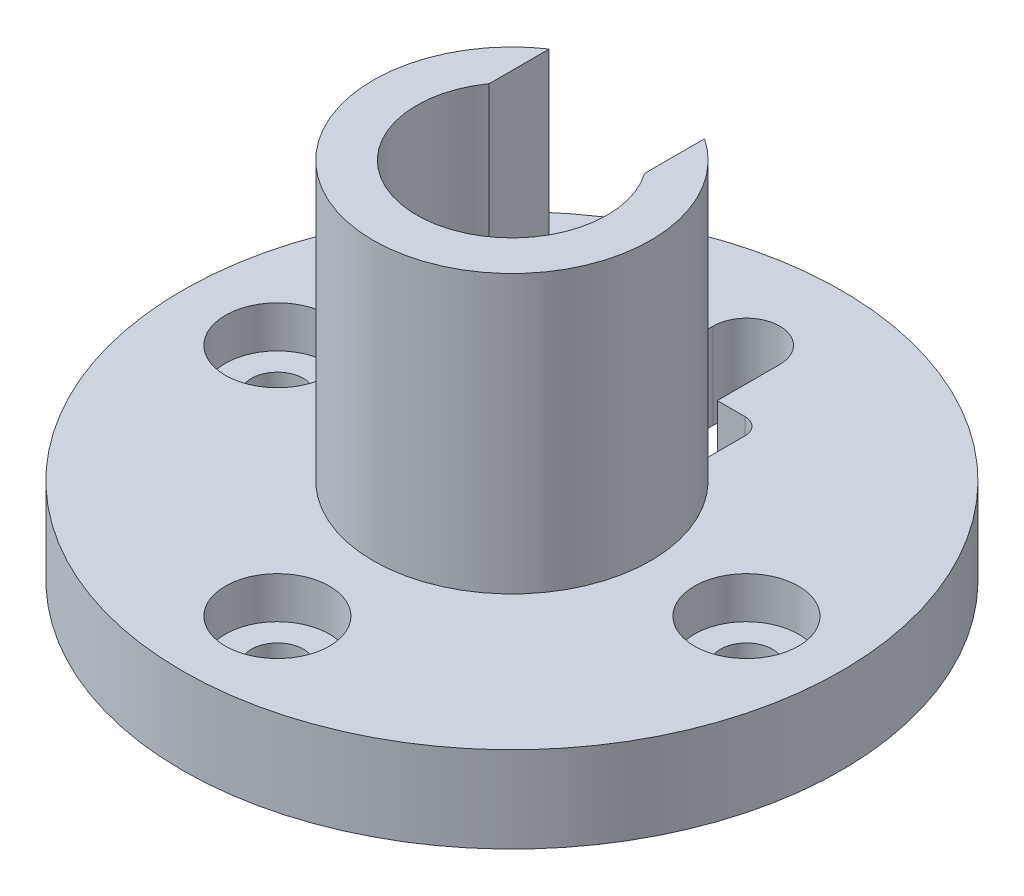
ISO-10303-21;
HEADER;
FILE_DESCRIPTION(('STEP AP214'),'2;1');
FILE_NAME('part.step','',(''),(''),'','','');
FILE_SCHEMA(('AUTOMOTIVE_DESIGN { 1 0 10303 214 1 1 1 1 }'));
ENDSEC;
DATA;
#1=APPLICATION_CONTEXT('core data for automotive mechanical design processes');
#2=APPLICATION_PROTOCOL_DEFINITION('international standard','automotive_design',2000,#1);
#3=PRODUCT_CONTEXT('',#1,'mechanical');
#4=PRODUCT('Part','Part','',(#3));
#5=PRODUCT_RELATED_PRODUCT_CATEGORY('part','',(#4));
#6=PRODUCT_DEFINITION_FORMATION('','',#4);
#7=PRODUCT_DEFINITION_CONTEXT('part definition',#1,'design');
#8=PRODUCT_DEFINITION('design','',#6,#7);
#9=PRODUCT_DEFINITION_SHAPE('','',#8);
#10=(LENGTH_UNIT() NAMED_UNIT(*) SI_UNIT(.MILLI.,.METRE.));
#11=(NAMED_UNIT(*) PLANE_ANGLE_UNIT() SI_UNIT($,.RADIAN.));
#12=(NAMED_UNIT(*) SI_UNIT($,.STERADIAN.) SOLID_ANGLE_UNIT());
#13=UNCERTAINTY_MEASURE_WITH_UNIT(LENGTH_MEASURE(1.E-05),#10,'distance_accuracy_value','');
#14=(GEOMETRIC_REPRESENTATION_CONTEXT(3) GLOBAL_UNCERTAINTY_ASSIGNED_CONTEXT((#13)) GLOBAL_UNIT_ASSIGNED_CONTEXT((#10,
#11,#12)) REPRESENTATION_CONTEXT('',''));
#15=CARTESIAN_POINT('',(0.,0.,0.));
#16=DIRECTION('',(0.,0.,1.));
#17=DIRECTION('',(1.,0.,0.));
#18=AXIS2_PLACEMENT_3D('',#15,#16,#17);
#19=CARTESIAN_POINT('',(0.,15.748,0.));
#20=DIRECTION('',(0.,-1.,0.));
#21=DIRECTION('',(0.,0.,-1.));
#22=AXIS2_PLACEMENT_3D('',#19,#20,#21);
#23=CYLINDRICAL_SURFACE('',#22,60.325);
#24=CARTESIAN_POINT('',(0.,15.748,0.));
#25=DIRECTION('',(0.,1.,0.));
#26=DIRECTION('',(0.,0.,1.));
#27=AXIS2_PLACEMENT_3D('',#24,#25,#26);
#28=CIRCLE('',#27,60.325);
#29=CARTESIAN_POINT('',(0.,15.748,60.325));
#30=VERTEX_POINT('',#29);
#31=EDGE_CURVE('E283',#30,#30,#28,.T.);
#32=ORIENTED_EDGE('',*,*,#31,.F.);
#33=EDGE_LOOP('',(#32));
#34=FACE_BOUND('',#33,.T.);
#35=CARTESIAN_POINT('',(0.,0.,0.));
#36=DIRECTION('',(0.,1.,0.));
#37=DIRECTION('',(0.,0.,1.));
#38=AXIS2_PLACEMENT_3D('',#35,#36,#37);
#39=CIRCLE('',#38,60.325);
#40=CARTESIAN_POINT('',(0.,0.,60.325));
#41=VERTEX_POINT('',#40);
#42=EDGE_CURVE('E263',#41,#41,#39,.T.);
#43=ORIENTED_EDGE('',*,*,#42,.T.);
#44=EDGE_LOOP('',(#43));
#45=FACE_BOUND('',#44,.T.);
#46=ADVANCED_FACE('F38',(#34,#45),#23,.T.);
#47=CARTESIAN_POINT('',(0.,15.748,0.));
#48=DIRECTION('',(0.,1.,0.));
#49=DIRECTION('',(0.,0.,1.));
#50=AXIS2_PLACEMENT_3D('',#47,#48,#49);
#51=PLANE('',#50);
#52=DIRECTION('',(0.,0.,1.));
#53=VECTOR('',#52,1.);
#54=CARTESIAN_POINT('',(-14.224,15.748,0.));
#55=LINE('',#54,#53);
#56=CARTESIAN_POINT('',(-14.224,15.748,-28.448));
#57=VERTEX_POINT('',#56);
#58=CARTESIAN_POINT('',(-14.224,15.748,-21.0437122200433));
#59=VERTEX_POINT('',#58);
#60=EDGE_CURVE('E201',#57,#59,#55,.T.);
#61=ORIENTED_EDGE('',*,*,#60,.F.);
#62=CARTESIAN_POINT('',(-11.176,15.748,-28.448));
#63=DIRECTION('',(0.,1.,0.));
#64=DIRECTION('',(0.,0.,1.));
#65=AXIS2_PLACEMENT_3D('',#62,#63,#64);
#66=CIRCLE('',#65,3.048);
#67=CARTESIAN_POINT('',(-11.176,15.748,-31.496));
#68=VERTEX_POINT('',#67);
#69=EDGE_CURVE('E47',#57,#68,#66,.F.);
#70=ORIENTED_EDGE('',*,*,#69,.T.);
#71=DIRECTION('',(-1.,0.,0.));
#72=VECTOR('',#71,1.);
#73=CARTESIAN_POINT('',(0.,15.748,-31.496));
#74=LINE('',#73,#72);
#75=CARTESIAN_POINT('',(-6.096,15.748,-31.496));
#76=VERTEX_POINT('',#75);
#77=EDGE_CURVE('E215',#76,#68,#74,.T.);
#78=ORIENTED_EDGE('',*,*,#77,.F.);
#79=DIRECTION('',(0.,0.,1.));
#80=VECTOR('',#79,1.);
#81=CARTESIAN_POINT('',(-6.096,15.748,0.));
#82=LINE('',#81,#80);
#83=CARTESIAN_POINT('',(-6.096,15.748,-42.926));
#84=VERTEX_POINT('',#83);
#85=EDGE_CURVE('E212',#84,#76,#82,.T.);
#86=ORIENTED_EDGE('',*,*,#85,.F.);
#87=CARTESIAN_POINT('',(0.,15.748,-42.926));
#88=DIRECTION('',(0.,1.,0.));
#89=DIRECTION('',(0.,0.,1.));
#90=AXIS2_PLACEMENT_3D('',#87,#88,#89);
#91=CIRCLE('',#90,6.096);
#92=CARTESIAN_POINT('',(6.096,15.748,-42.926));
#93=VERTEX_POINT('',#92);
#94=EDGE_CURVE('E209',#93,#84,#91,.T.);
#95=ORIENTED_EDGE('',*,*,#94,.F.);
#96=DIRECTION('',(0.,0.,-1.));
#97=VECTOR('',#96,1.);
#98=CARTESIAN_POINT('',(6.09600000000001,15.748,0.));
#99=LINE('',#98,#97);
#100=CARTESIAN_POINT('',(6.096,15.748,-31.496));
#101=VERTEX_POINT('',#100);
#102=EDGE_CURVE('E206',#101,#93,#99,.T.);
#103=ORIENTED_EDGE('',*,*,#102,.F.);
#104=DIRECTION('',(-1.,0.,0.));
#105=VECTOR('',#104,1.);
#106=CARTESIAN_POINT('',(0.,15.748,-31.496));
#107=LINE('',#106,#105);
#108=CARTESIAN_POINT('',(11.176,15.748,-31.496));
#109=VERTEX_POINT('',#108);
#110=EDGE_CURVE('E148',#109,#101,#107,.T.);
#111=ORIENTED_EDGE('',*,*,#110,.F.);
#112=CARTESIAN_POINT('',(11.176,15.748,-28.448));
#113=DIRECTION('',(0.,1.,0.));
#114=DIRECTION('',(0.,0.,1.));
#115=AXIS2_PLACEMENT_3D('',#112,#113,#114);
#116=CIRCLE('',#115,3.048);
#117=CARTESIAN_POINT('',(14.224,15.748,-28.448));
#118=VERTEX_POINT('',#117);
#119=EDGE_CURVE('E310',#109,#118,#116,.F.);
#120=ORIENTED_EDGE('',*,*,#119,.T.);
#121=DIRECTION('',(0.,0.,-1.));
#122=VECTOR('',#121,1.);
#123=CARTESIAN_POINT('',(14.224,15.748,0.));
#124=LINE('',#123,#122);
#125=CARTESIAN_POINT('',(14.224,15.748,-21.0437122200433));
#126=VERTEX_POINT('',#125);
#127=EDGE_CURVE('E193',#126,#118,#124,.T.);
#128=ORIENTED_EDGE('',*,*,#127,.F.);
#129=CARTESIAN_POINT('',(0.,15.748,0.));
#130=DIRECTION('',(0.,1.,0.));
#131=DIRECTION('',(0.,0.,1.));
#132=AXIS2_PLACEMENT_3D('',#129,#130,#131);
#133=CIRCLE('',#132,25.4);
#134=EDGE_CURVE('E223',#59,#126,#133,.T.);
#135=ORIENTED_EDGE('',*,*,#134,.F.);
#136=EDGE_LOOP('',(#61,#70,#78,#86,#95,#103,#111,#120,#128,#135));
#137=FACE_BOUND('',#136,.T.);
#138=CARTESIAN_POINT('',(0.,15.748,42.926));
#139=DIRECTION('',(0.,1.,0.));
#140=DIRECTION('',(0.,0.,1.));
#141=AXIS2_PLACEMENT_3D('',#138,#139,#140);
#142=CIRCLE('',#141,9.525);
#143=CARTESIAN_POINT('',(0.,15.748,52.451));
#144=VERTEX_POINT('',#143);
#145=EDGE_CURVE('E264',#144,#144,#142,.T.);
#146=ORIENTED_EDGE('',*,*,#145,.F.);
#147=EDGE_LOOP('',(#146));
#148=FACE_BOUND('',#147,.T.);
#149=CARTESIAN_POINT('',(42.926,15.748,0.));
#150=DIRECTION('',(0.,1.,0.));
#151=DIRECTION('',(0.,0.,1.));
#152=AXIS2_PLACEMENT_3D('',#149,#150,#151);
#153=CIRCLE('',#152,9.525);
#154=CARTESIAN_POINT('',(42.926,15.748,9.525));
#155=VERTEX_POINT('',#154);
#156=EDGE_CURVE('E272',#155,#155,#153,.T.);
#157=ORIENTED_EDGE('',*,*,#156,.F.);
#158=EDGE_LOOP('',(#157));
#159=FACE_BOUND('',#158,.T.);
#160=CARTESIAN_POINT('',(-42.926,15.748,0.));
#161=DIRECTION('',(0.,1.,0.));
#162=DIRECTION('',(0.,0.,1.));
#163=AXIS2_PLACEMENT_3D('',#160,#161,#162);
#164=CIRCLE('',#163,9.525);
#165=CARTESIAN_POINT('',(-42.926,15.748,9.525));
#166=VERTEX_POINT('',#165);
#167=EDGE_CURVE('E239',#166,#166,#164,.T.);
#168=ORIENTED_EDGE('',*,*,#167,.F.);
#169=EDGE_LOOP('',(#168));
#170=FACE_BOUND('',#169,.T.);
#171=ORIENTED_EDGE('',*,*,#31,.T.);
#172=EDGE_LOOP('',(#171));
#173=FACE_BOUND('',#172,.T.);
#174=ADVANCED_FACE('F360',(#137,#148,#159,#170,#173),#51,.T.);
#175=CARTESIAN_POINT('',(0.,0.,0.));
#176=DIRECTION('',(0.,1.,0.));
#177=DIRECTION('',(0.,0.,1.));
#178=AXIS2_PLACEMENT_3D('',#175,#176,#177);
#179=PLANE('',#178);
#180=DIRECTION('',(-1.,0.,0.));
#181=VECTOR('',#180,1.);
#182=CARTESIAN_POINT('',(-14.224,0.,-31.496));
#183=LINE('',#182,#181);
#184=CARTESIAN_POINT('',(-6.096,0.,-31.496));
#185=VERTEX_POINT('',#184);
#186=CARTESIAN_POINT('',(-11.176,0.,-31.496));
#187=VERTEX_POINT('',#186);
#188=EDGE_CURVE('E153',#185,#187,#183,.T.);
#189=ORIENTED_EDGE('',*,*,#188,.T.);
#190=CARTESIAN_POINT('',(-11.176,0.,-28.448));
#191=DIRECTION('',(0.,1.,0.));
#192=DIRECTION('',(0.,0.,1.));
#193=AXIS2_PLACEMENT_3D('',#190,#191,#192);
#194=CIRCLE('',#193,3.048);
#195=CARTESIAN_POINT('',(-14.224,0.,-28.448));
#196=VERTEX_POINT('',#195);
#197=EDGE_CURVE('E11',#187,#196,#194,.T.);
#198=ORIENTED_EDGE('',*,*,#197,.T.);
#199=DIRECTION('',(0.,0.,1.));
#200=VECTOR('',#199,1.);
#201=CARTESIAN_POINT('',(-14.224,0.,-31.496));
#202=LINE('',#201,#200);
#203=CARTESIAN_POINT('',(-14.224,0.,-10.064171071678));
#204=VERTEX_POINT('',#203);
#205=EDGE_CURVE('E178',#196,#204,#202,.T.);
#206=ORIENTED_EDGE('',*,*,#205,.T.);
#207=CARTESIAN_POINT('',(0.,0.,0.));
#208=DIRECTION('',(0.,1.,0.));
#209=DIRECTION('',(0.,0.,1.));
#210=AXIS2_PLACEMENT_3D('',#207,#208,#209);
#211=CIRCLE('',#210,17.4244);
#212=CARTESIAN_POINT('',(14.224,0.,-10.064171071678));
#213=VERTEX_POINT('',#212);
#214=EDGE_CURVE('E219',#204,#213,#211,.T.);
#215=ORIENTED_EDGE('',*,*,#214,.T.);
#216=DIRECTION('',(0.,0.,-1.));
#217=VECTOR('',#216,1.);
#218=CARTESIAN_POINT('',(14.224,0.,-31.496));
#219=LINE('',#218,#217);
#220=CARTESIAN_POINT('',(14.224,0.,-28.448));
#221=VERTEX_POINT('',#220);
#222=EDGE_CURVE('E142',#213,#221,#219,.T.);
#223=ORIENTED_EDGE('',*,*,#222,.T.);
#224=CARTESIAN_POINT('',(11.176,0.,-28.448));
#225=DIRECTION('',(0.,1.,0.));
#226=DIRECTION('',(0.,0.,1.));
#227=AXIS2_PLACEMENT_3D('',#224,#225,#226);
#228=CIRCLE('',#227,3.048);
#229=CARTESIAN_POINT('',(11.176,0.,-31.496));
#230=VERTEX_POINT('',#229);
#231=EDGE_CURVE('E137',#221,#230,#228,.T.);
#232=ORIENTED_EDGE('',*,*,#231,.T.);
#233=DIRECTION('',(-1.,0.,0.));
#234=VECTOR('',#233,1.);
#235=CARTESIAN_POINT('',(6.096,0.,-31.496));
#236=LINE('',#235,#234);
#237=CARTESIAN_POINT('',(6.096,0.,-31.496));
#238=VERTEX_POINT('',#237);
#239=EDGE_CURVE('E128',#230,#238,#236,.T.);
#240=ORIENTED_EDGE('',*,*,#239,.T.);
#241=DIRECTION('',(0.,0.,-1.));
#242=VECTOR('',#241,1.);
#243=CARTESIAN_POINT('',(6.096,0.,-42.926));
#244=LINE('',#243,#242);
#245=CARTESIAN_POINT('',(6.096,0.,-42.926));
#246=VERTEX_POINT('',#245);
#247=EDGE_CURVE('E134',#238,#246,#244,.T.);
#248=ORIENTED_EDGE('',*,*,#247,.T.);
#249=CARTESIAN_POINT('',(0.,0.,-42.926));
#250=DIRECTION('',(0.,1.,0.));
#251=DIRECTION('',(0.,0.,1.));
#252=AXIS2_PLACEMENT_3D('',#249,#250,#251);
#253=CIRCLE('',#252,6.096);
#254=CARTESIAN_POINT('',(-6.096,0.,-42.926));
#255=VERTEX_POINT('',#254);
#256=EDGE_CURVE('E159',#246,#255,#253,.T.);
#257=ORIENTED_EDGE('',*,*,#256,.T.);
#258=DIRECTION('',(0.,0.,1.));
#259=VECTOR('',#258,1.);
#260=CARTESIAN_POINT('',(-6.096,0.,-42.926));
#261=LINE('',#260,#259);
#262=EDGE_CURVE('E163',#255,#185,#261,.T.);
#263=ORIENTED_EDGE('',*,*,#262,.T.);
#264=EDGE_LOOP('',(#189,#198,#206,#215,#223,#232,#240,#248,#257,#263));
#265=FACE_BOUND('',#264,.T.);
#266=CARTESIAN_POINT('',(-42.926,0.,0.));
#267=DIRECTION('',(0.,1.,0.));
#268=DIRECTION('',(0.,0.,1.));
#269=AXIS2_PLACEMENT_3D('',#266,#267,#268);
#270=CIRCLE('',#269,4.7625);
#271=CARTESIAN_POINT('',(-42.926,0.,4.7625));
#272=VERTEX_POINT('',#271);
#273=EDGE_CURVE('E235',#272,#272,#270,.T.);
#274=ORIENTED_EDGE('',*,*,#273,.T.);
#275=EDGE_LOOP('',(#274));
#276=FACE_BOUND('',#275,.T.);
#277=CARTESIAN_POINT('',(42.926,0.,0.));
#278=DIRECTION('',(0.,1.,0.));
#279=DIRECTION('',(0.,0.,1.));
#280=AXIS2_PLACEMENT_3D('',#277,#278,#279);
#281=CIRCLE('',#280,4.7625);
#282=CARTESIAN_POINT('',(42.926,0.,4.7625));
#283=VERTEX_POINT('',#282);
#284=EDGE_CURVE('E244',#283,#283,#281,.T.);
#285=ORIENTED_EDGE('',*,*,#284,.T.);
#286=EDGE_LOOP('',(#285));
#287=FACE_BOUND('',#286,.T.);
#288=CARTESIAN_POINT('',(0.,0.,42.926));
#289=DIRECTION('',(0.,1.,0.));
#290=DIRECTION('',(0.,0.,1.));
#291=AXIS2_PLACEMENT_3D('',#288,#289,#290);
#292=CIRCLE('',#291,4.7625);
#293=CARTESIAN_POINT('',(0.,0.,47.6885));
#294=VERTEX_POINT('',#293);
#295=EDGE_CURVE('E252',#294,#294,#292,.T.);
#296=ORIENTED_EDGE('',*,*,#295,.T.);
#297=EDGE_LOOP('',(#296));
#298=FACE_BOUND('',#297,.T.);
#299=ORIENTED_EDGE('',*,*,#42,.F.);
#300=EDGE_LOOP('',(#299));
#301=FACE_BOUND('',#300,.T.);
#302=ADVANCED_FACE('F130',(#265,#276,#287,#298,#301),#179,.F.);
#303=CARTESIAN_POINT('',(-42.926,8.128,0.));
#304=DIRECTION('',(0.,1.,0.));
#305=DIRECTION('',(0.,0.,1.));
#306=AXIS2_PLACEMENT_3D('',#303,#304,#305);
#307=CYLINDRICAL_SURFACE('',#306,9.525);
#308=CARTESIAN_POINT('',(-42.926,8.128,0.));
#309=DIRECTION('',(0.,1.,0.));
#310=DIRECTION('',(0.,0.,1.));
#311=AXIS2_PLACEMENT_3D('',#308,#309,#310);
#312=CIRCLE('',#311,9.525);
#313=CARTESIAN_POINT('',(-42.926,8.128,9.525));
#314=VERTEX_POINT('',#313);
#315=EDGE_CURVE('E276',#314,#314,#312,.T.);
#316=CARTESIAN_POINT('',(-42.926,8.128,9.525));
#317=CARTESIAN_POINT('',(-42.926,8.207375,9.525));
#318=CARTESIAN_POINT('',(-42.926,8.28675,9.525));
#319=CARTESIAN_POINT('',(-42.926,8.4455,9.525));
#320=CARTESIAN_POINT('',(-42.926,8.524875,9.525));
#321=CARTESIAN_POINT('',(-42.926,8.683625,9.525));
#322=CARTESIAN_POINT('',(-42.926,8.763,9.525));
#323=CARTESIAN_POINT('',(-42.926,8.92175,9.525));
#324=CARTESIAN_POINT('',(-42.926,9.001125,9.525));
#325=CARTESIAN_POINT('',(-42.926,9.159875,9.525));
#326=CARTESIAN_POINT('',(-42.926,9.23925,9.525));
#327=CARTESIAN_POINT('',(-42.926,9.398,9.525));
#328=CARTESIAN_POINT('',(-42.926,9.477375,9.525));
#329=CARTESIAN_POINT('',(-42.926,9.636125,9.525));
#330=CARTESIAN_POINT('',(-42.926,9.7155,9.525));
#331=CARTESIAN_POINT('',(-42.926,9.87425,9.525));
#332=CARTESIAN_POINT('',(-42.926,9.953625,9.525));
#333=CARTESIAN_POINT('',(-42.926,10.112375,9.525));
#334=CARTESIAN_POINT('',(-42.926,10.19175,9.525));
#335=CARTESIAN_POINT('',(-42.926,10.3505,9.525));
#336=CARTESIAN_POINT('',(-42.926,10.429875,9.525));
#337=CARTESIAN_POINT('',(-42.926,10.588625,9.525));
#338=CARTESIAN_POINT('',(-42.926,10.668,9.525));
#339=CARTESIAN_POINT('',(-42.926,10.82675,9.525));
#340=CARTESIAN_POINT('',(-42.926,10.906125,9.525));
#341=CARTESIAN_POINT('',(-42.926,11.064875,9.525));
#342=CARTESIAN_POINT('',(-42.926,11.14425,9.525));
#343=CARTESIAN_POINT('',(-42.926,11.303,9.525));
#344=CARTESIAN_POINT('',(-42.926,11.382375,9.525));
#345=CARTESIAN_POINT('',(-42.926,11.541125,9.525));
#346=CARTESIAN_POINT('',(-42.926,11.6205,9.525));
#347=CARTESIAN_POINT('',(-42.926,11.77925,9.525));
#348=CARTESIAN_POINT('',(-42.926,11.858625,9.525));
#349=CARTESIAN_POINT('',(-42.926,12.017375,9.525));
#350=CARTESIAN_POINT('',(-42.926,12.09675,9.525));
#351=CARTESIAN_POINT('',(-42.926,12.2555,9.525));
#352=CARTESIAN_POINT('',(-42.926,12.334875,9.525));
#353=CARTESIAN_POINT('',(-42.926,12.493625,9.525));
#354=CARTESIAN_POINT('',(-42.926,12.573,9.525));
#355=CARTESIAN_POINT('',(-42.926,12.73175,9.525));
#356=CARTESIAN_POINT('',(-42.926,12.811125,9.525));
#357=CARTESIAN_POINT('',(-42.926,12.969875,9.525));
#358=CARTESIAN_POINT('',(-42.926,13.04925,9.525));
#359=CARTESIAN_POINT('',(-42.926,13.208,9.525));
#360=CARTESIAN_POINT('',(-42.926,13.287375,9.525));
#361=CARTESIAN_POINT('',(-42.926,13.446125,9.525));
#362=CARTESIAN_POINT('',(-42.926,13.5255,9.525));
#363=CARTESIAN_POINT('',(-42.926,13.68425,9.525));
#364=CARTESIAN_POINT('',(-42.926,13.763625,9.525));
#365=CARTESIAN_POINT('',(-42.926,13.922375,9.525));
#366=CARTESIAN_POINT('',(-42.926,14.00175,9.525));
#367=CARTESIAN_POINT('',(-42.926,14.1605,9.525));
#368=CARTESIAN_POINT('',(-42.926,14.239875,9.525));
#369=CARTESIAN_POINT('',(-42.926,14.398625,9.525));
#370=CARTESIAN_POINT('',(-42.926,14.478,9.525));
#371=CARTESIAN_POINT('',(-42.926,14.63675,9.525));
#372=CARTESIAN_POINT('',(-42.926,14.716125,9.525));
#373=CARTESIAN_POINT('',(-42.926,14.874875,9.525));
#374=CARTESIAN_POINT('',(-42.926,14.95425,9.525));
#375=CARTESIAN_POINT('',(-42.926,15.113,9.525));
#376=CARTESIAN_POINT('',(-42.926,15.192375,9.525));
#377=CARTESIAN_POINT('',(-42.926,15.351125,9.525));
#378=CARTESIAN_POINT('',(-42.926,15.4305,9.525));
#379=CARTESIAN_POINT('',(-42.926,15.58925,9.525));
#380=CARTESIAN_POINT('',(-42.926,15.668625,9.525));
#381=CARTESIAN_POINT('',(-42.926,15.748,9.525));
#382=B_SPLINE_CURVE_WITH_KNOTS('',3,(#316,#317,#318,#319,#320,#321,#322,#323,#324,#325,#326,
#327,#328,#329,#330,#331,#332,#333,#334,#335,#336,#337,#338,#339,#340,#341,#342,#343,#344,#345,
#346,#347,#348,#349,#350,#351,#352,#353,#354,#355,#356,#357,#358,#359,#360,#361,#362,#363,#364,
#365,#366,#367,#368,#369,#370,#371,#372,#373,#374,#375,#376,#377,#378,#379,#380,#381),
.UNSPECIFIED.,.F.,.F.,(4,2,2,2,2,2,2,2,2,2,2,2,2,2,2,2,2,2,2,2,2,2,2,2,2,2,2,2,2,2,2,2,4),(0.,
0.238124999999999,0.476249999999999,0.714374999999998,0.952499999999998,1.190625,1.42875,
1.666875,1.905,2.143125,2.38125,2.619375,2.8575,3.095625,3.33375,3.571875,3.81,4.048125,4.28625,
4.524375,4.7625,5.000625,5.23875,5.476875,5.715,5.953125,6.19125,6.429375,6.6675,6.905625,
7.14375,7.381875,7.61999999999999),.UNSPECIFIED.);
#383=EDGE_CURVE('BSEAM386',#314,#166,#382,.T.);
#384=ORIENTED_EDGE('',*,*,#315,.F.);
#385=ORIENTED_EDGE('',*,*,#167,.T.);
#386=ORIENTED_EDGE('',*,*,#383,.T.);
#387=ORIENTED_EDGE('',*,*,#383,.F.);
#388=EDGE_LOOP('',(#384,#386,#385,#387));
#389=FACE_BOUND('',#388,.T.);
#390=ADVANCED_FACE('F386',(#389),#307,.F.);
#391=CARTESIAN_POINT('',(-42.926,8.128,0.));
#392=DIRECTION('',(0.,1.,0.));
#393=DIRECTION('',(0.,0.,1.));
#394=AXIS2_PLACEMENT_3D('',#391,#392,#393);
#395=PLANE('',#394);
#396=CARTESIAN_POINT('',(-42.926,8.128,0.));
#397=DIRECTION('',(0.,1.,0.));
#398=DIRECTION('',(0.,0.,1.));
#399=AXIS2_PLACEMENT_3D('',#396,#397,#398);
#400=CIRCLE('',#399,4.7625);
#401=CARTESIAN_POINT('',(-42.926,8.128,4.7625));
#402=VERTEX_POINT('',#401);
#403=EDGE_CURVE('E240',#402,#402,#400,.T.);
#404=ORIENTED_EDGE('',*,*,#403,.F.);
#405=EDGE_LOOP('',(#404));
#406=FACE_BOUND('',#405,.T.);
#407=ORIENTED_EDGE('',*,*,#315,.T.);
#408=EDGE_LOOP('',(#407));
#409=FACE_BOUND('',#408,.T.);
#410=ADVANCED_FACE('F390',(#406,#409),#395,.T.);
#411=CARTESIAN_POINT('',(42.926,8.128,0.));
#412=DIRECTION('',(0.,1.,0.));
#413=DIRECTION('',(0.,0.,1.));
#414=AXIS2_PLACEMENT_3D('',#411,#412,#413);
#415=CYLINDRICAL_SURFACE('',#414,9.525);
#416=CARTESIAN_POINT('',(42.926,8.128,0.));
#417=DIRECTION('',(0.,1.,0.));
#418=DIRECTION('',(0.,0.,1.));
#419=AXIS2_PLACEMENT_3D('',#416,#417,#418);
#420=CIRCLE('',#419,9.525);
#421=CARTESIAN_POINT('',(42.926,8.128,9.525));
#422=VERTEX_POINT('',#421);
#423=EDGE_CURVE('E268',#422,#422,#420,.T.);
#424=CARTESIAN_POINT('',(42.926,8.128,9.525));
#425=CARTESIAN_POINT('',(42.926,8.207375,9.525));
#426=CARTESIAN_POINT('',(42.926,8.28675,9.525));
#427=CARTESIAN_POINT('',(42.926,8.4455,9.525));
#428=CARTESIAN_POINT('',(42.926,8.524875,9.525));
#429=CARTESIAN_POINT('',(42.926,8.683625,9.525));
#430=CARTESIAN_POINT('',(42.926,8.763,9.525));
#431=CARTESIAN_POINT('',(42.926,8.92175,9.525));
#432=CARTESIAN_POINT('',(42.926,9.001125,9.525));
#433=CARTESIAN_POINT('',(42.926,9.159875,9.525));
#434=CARTESIAN_POINT('',(42.926,9.23925,9.525));
#435=CARTESIAN_POINT('',(42.926,9.398,9.525));
#436=CARTESIAN_POINT('',(42.926,9.477375,9.525));
#437=CARTESIAN_POINT('',(42.926,9.636125,9.525));
#438=CARTESIAN_POINT('',(42.926,9.7155,9.525));
#439=CARTESIAN_POINT('',(42.926,9.87425,9.525));
#440=CARTESIAN_POINT('',(42.926,9.953625,9.525));
#441=CARTESIAN_POINT('',(42.926,10.112375,9.525));
#442=CARTESIAN_POINT('',(42.926,10.19175,9.525));
#443=CARTESIAN_POINT('',(42.926,10.3505,9.525));
#444=CARTESIAN_POINT('',(42.926,10.429875,9.525));
#445=CARTESIAN_POINT('',(42.926,10.588625,9.525));
#446=CARTESIAN_POINT('',(42.926,10.668,9.525));
#447=CARTESIAN_POINT('',(42.926,10.82675,9.525));
#448=CARTESIAN_POINT('',(42.926,10.906125,9.525));
#449=CARTESIAN_POINT('',(42.926,11.064875,9.525));
#450=CARTESIAN_POINT('',(42.926,11.14425,9.525));
#451=CARTESIAN_POINT('',(42.926,11.303,9.525));
#452=CARTESIAN_POINT('',(42.926,11.382375,9.525));
#453=CARTESIAN_POINT('',(42.926,11.541125,9.525));
#454=CARTESIAN_POINT('',(42.926,11.6205,9.525));
#455=CARTESIAN_POINT('',(42.926,11.77925,9.525));
#456=CARTESIAN_POINT('',(42.926,11.858625,9.525));
#457=CARTESIAN_POINT('',(42.926,12.017375,9.525));
#458=CARTESIAN_POINT('',(42.926,12.09675,9.525));
#459=CARTESIAN_POINT('',(42.926,12.2555,9.525));
#460=CARTESIAN_POINT('',(42.926,12.334875,9.525));
#461=CARTESIAN_POINT('',(42.926,12.493625,9.525));
#462=CARTESIAN_POINT('',(42.926,12.573,9.525));
#463=CARTESIAN_POINT('',(42.926,12.73175,9.525));
#464=CARTESIAN_POINT('',(42.926,12.811125,9.525));
#465=CARTESIAN_POINT('',(42.926,12.969875,9.525));
#466=CARTESIAN_POINT('',(42.926,13.04925,9.525));
#467=CARTESIAN_POINT('',(42.926,13.208,9.525));
#468=CARTESIAN_POINT('',(42.926,13.287375,9.525));
#469=CARTESIAN_POINT('',(42.926,13.446125,9.525));
#470=CARTESIAN_POINT('',(42.926,13.5255,9.525));
#471=CARTESIAN_POINT('',(42.926,13.68425,9.525));
#472=CARTESIAN_POINT('',(42.926,13.763625,9.525));
#473=CARTESIAN_POINT('',(42.926,13.922375,9.525));
#474=CARTESIAN_POINT('',(42.926,14.00175,9.525));
#475=CARTESIAN_POINT('',(42.926,14.1605,9.525));
#476=CARTESIAN_POINT('',(42.926,14.239875,9.525));
#477=CARTESIAN_POINT('',(42.926,14.398625,9.525));
#478=CARTESIAN_POINT('',(42.926,14.478,9.525));
#479=CARTESIAN_POINT('',(42.926,14.63675,9.525));
#480=CARTESIAN_POINT('',(42.926,14.716125,9.525));
#481=CARTESIAN_POINT('',(42.926,14.874875,9.525));
#482=CARTESIAN_POINT('',(42.926,14.95425,9.525));
#483=CARTESIAN_POINT('',(42.926,15.113,9.525));
#484=CARTESIAN_POINT('',(42.926,15.192375,9.525));
#485=CARTESIAN_POINT('',(42.926,15.351125,9.525));
#486=CARTESIAN_POINT('',(42.926,15.4305,9.525));
#487=CARTESIAN_POINT('',(42.926,15.58925,9.525));
#488=CARTESIAN_POINT('',(42.926,15.668625,9.525));
#489=CARTESIAN_POINT('',(42.926,15.748,9.525));
#490=B_SPLINE_CURVE_WITH_KNOTS('',3,(#424,#425,#426,#427,#428,#429,#430,#431,#432,#433,#434,
#435,#436,#437,#438,#439,#440,#441,#442,#443,#444,#445,#446,#447,#448,#449,#450,#451,#452,#453,
#454,#455,#456,#457,#458,#459,#460,#461,#462,#463,#464,#465,#466,#467,#468,#469,#470,#471,#472,
#473,#474,#475,#476,#477,#478,#479,#480,#481,#482,#483,#484,#485,#486,#487,#488,#489),
.UNSPECIFIED.,.F.,.F.,(4,2,2,2,2,2,2,2,2,2,2,2,2,2,2,2,2,2,2,2,2,2,2,2,2,2,2,2,2,2,2,2,4),(0.,
0.238124999999999,0.476249999999999,0.714374999999998,0.952499999999998,1.190625,1.42875,
1.666875,1.905,2.143125,2.38125,2.619375,2.8575,3.095625,3.33375,3.571875,3.81,4.048125,4.28625,
4.524375,4.7625,5.000625,5.23875,5.476875,5.715,5.953125,6.19125,6.429375,6.6675,6.905625,
7.14375,7.381875,7.61999999999999),.UNSPECIFIED.);
#491=EDGE_CURVE('BSEAM394',#422,#155,#490,.T.);
#492=ORIENTED_EDGE('',*,*,#423,.F.);
#493=ORIENTED_EDGE('',*,*,#156,.T.);
#494=ORIENTED_EDGE('',*,*,#491,.T.);
#495=ORIENTED_EDGE('',*,*,#491,.F.);
#496=EDGE_LOOP('',(#492,#494,#493,#495));
#497=FACE_BOUND('',#496,.T.);
#498=ADVANCED_FACE('F394',(#497),#415,.F.);
#499=CARTESIAN_POINT('',(42.926,8.128,0.));
#500=DIRECTION('',(0.,1.,0.));
#501=DIRECTION('',(0.,0.,1.));
#502=AXIS2_PLACEMENT_3D('',#499,#500,#501);
#503=PLANE('',#502);
#504=CARTESIAN_POINT('',(42.926,8.128,0.));
#505=DIRECTION('',(0.,1.,0.));
#506=DIRECTION('',(0.,0.,1.));
#507=AXIS2_PLACEMENT_3D('',#504,#505,#506);
#508=CIRCLE('',#507,4.7625);
#509=CARTESIAN_POINT('',(42.926,8.128,4.7625));
#510=VERTEX_POINT('',#509);
#511=EDGE_CURVE('E248',#510,#510,#508,.T.);
#512=ORIENTED_EDGE('',*,*,#511,.F.);
#513=EDGE_LOOP('',(#512));
#514=FACE_BOUND('',#513,.T.);
#515=ORIENTED_EDGE('',*,*,#423,.T.);
#516=EDGE_LOOP('',(#515));
#517=FACE_BOUND('',#516,.T.);
#518=ADVANCED_FACE('F398',(#514,#517),#503,.T.);
#519=CARTESIAN_POINT('',(0.,8.128,42.926));
#520=DIRECTION('',(0.,1.,0.));
#521=DIRECTION('',(0.,0.,1.));
#522=AXIS2_PLACEMENT_3D('',#519,#520,#521);
#523=CYLINDRICAL_SURFACE('',#522,9.525);
#524=CARTESIAN_POINT('',(0.,8.128,42.926));
#525=DIRECTION('',(0.,1.,0.));
#526=DIRECTION('',(0.,0.,1.));
#527=AXIS2_PLACEMENT_3D('',#524,#525,#526);
#528=CIRCLE('',#527,9.525);
#529=CARTESIAN_POINT('',(0.,8.128,52.451));
#530=VERTEX_POINT('',#529);
#531=EDGE_CURVE('E259',#530,#530,#528,.T.);
#532=CARTESIAN_POINT('',(0.,8.128,52.451));
#533=CARTESIAN_POINT('',(0.,8.207375,52.451));
#534=CARTESIAN_POINT('',(0.,8.28675,52.451));
#535=CARTESIAN_POINT('',(0.,8.4455,52.451));
#536=CARTESIAN_POINT('',(0.,8.524875,52.451));
#537=CARTESIAN_POINT('',(0.,8.683625,52.451));
#538=CARTESIAN_POINT('',(0.,8.763,52.451));
#539=CARTESIAN_POINT('',(0.,8.92175,52.451));
#540=CARTESIAN_POINT('',(0.,9.001125,52.451));
#541=CARTESIAN_POINT('',(0.,9.159875,52.451));
#542=CARTESIAN_POINT('',(0.,9.23925,52.451));
#543=CARTESIAN_POINT('',(0.,9.398,52.451));
#544=CARTESIAN_POINT('',(0.,9.477375,52.451));
#545=CARTESIAN_POINT('',(0.,9.636125,52.451));
#546=CARTESIAN_POINT('',(0.,9.7155,52.451));
#547=CARTESIAN_POINT('',(0.,9.87425,52.451));
#548=CARTESIAN_POINT('',(0.,9.953625,52.451));
#549=CARTESIAN_POINT('',(0.,10.112375,52.451));
#550=CARTESIAN_POINT('',(0.,10.19175,52.451));
#551=CARTESIAN_POINT('',(0.,10.3505,52.451));
#552=CARTESIAN_POINT('',(0.,10.429875,52.451));
#553=CARTESIAN_POINT('',(0.,10.588625,52.451));
#554=CARTESIAN_POINT('',(0.,10.668,52.451));
#555=CARTESIAN_POINT('',(0.,10.82675,52.451));
#556=CARTESIAN_POINT('',(0.,10.906125,52.451));
#557=CARTESIAN_POINT('',(0.,11.064875,52.451));
#558=CARTESIAN_POINT('',(0.,11.14425,52.451));
#559=CARTESIAN_POINT('',(0.,11.303,52.451));
#560=CARTESIAN_POINT('',(0.,11.382375,52.451));
#561=CARTESIAN_POINT('',(0.,11.541125,52.451));
#562=CARTESIAN_POINT('',(0.,11.6205,52.451));
#563=CARTESIAN_POINT('',(0.,11.77925,52.451));
#564=CARTESIAN_POINT('',(0.,11.858625,52.451));
#565=CARTESIAN_POINT('',(0.,12.017375,52.451));
#566=CARTESIAN_POINT('',(0.,12.09675,52.451));
#567=CARTESIAN_POINT('',(0.,12.2555,52.451));
#568=CARTESIAN_POINT('',(0.,12.334875,52.451));
#569=CARTESIAN_POINT('',(0.,12.493625,52.451));
#570=CARTESIAN_POINT('',(0.,12.573,52.451));
#571=CARTESIAN_POINT('',(0.,12.73175,52.451));
#572=CARTESIAN_POINT('',(0.,12.811125,52.451));
#573=CARTESIAN_POINT('',(0.,12.969875,52.451));
#574=CARTESIAN_POINT('',(0.,13.04925,52.451));
#575=CARTESIAN_POINT('',(0.,13.208,52.451));
#576=CARTESIAN_POINT('',(0.,13.287375,52.451));
#577=CARTESIAN_POINT('',(0.,13.446125,52.451));
#578=CARTESIAN_POINT('',(0.,13.5255,52.451));
#579=CARTESIAN_POINT('',(0.,13.68425,52.451));
#580=CARTESIAN_POINT('',(0.,13.763625,52.451));
#581=CARTESIAN_POINT('',(0.,13.922375,52.451));
#582=CARTESIAN_POINT('',(0.,14.00175,52.451));
#583=CARTESIAN_POINT('',(0.,14.1605,52.451));
#584=CARTESIAN_POINT('',(0.,14.239875,52.451));
#585=CARTESIAN_POINT('',(0.,14.398625,52.451));
#586=CARTESIAN_POINT('',(0.,14.478,52.451));
#587=CARTESIAN_POINT('',(0.,14.63675,52.451));
#588=CARTESIAN_POINT('',(0.,14.716125,52.451));
#589=CARTESIAN_POINT('',(0.,14.874875,52.451));
#590=CARTESIAN_POINT('',(0.,14.95425,52.451));
#591=CARTESIAN_POINT('',(0.,15.113,52.451));
#592=CARTESIAN_POINT('',(0.,15.192375,52.451));
#593=CARTESIAN_POINT('',(0.,15.351125,52.451));
#594=CARTESIAN_POINT('',(0.,15.4305,52.451));
#595=CARTESIAN_POINT('',(0.,15.58925,52.451));
#596=CARTESIAN_POINT('',(0.,15.668625,52.451));
#597=CARTESIAN_POINT('',(0.,15.748,52.451));
#598=B_SPLINE_CURVE_WITH_KNOTS('',3,(#532,#533,#534,#535,#536,#537,#538,#539,#540,#541,#542,
#543,#544,#545,#546,#547,#548,#549,#550,#551,#552,#553,#554,#555,#556,#557,#558,#559,#560,#561,
#562,#563,#564,#565,#566,#567,#568,#569,#570,#571,#572,#573,#574,#575,#576,#577,#578,#579,#580,
#581,#582,#583,#584,#585,#586,#587,#588,#589,#590,#591,#592,#593,#594,#595,#596,#597),
.UNSPECIFIED.,.F.,.F.,(4,2,2,2,2,2,2,2,2,2,2,2,2,2,2,2,2,2,2,2,2,2,2,2,2,2,2,2,2,2,2,2,4),(0.,
0.238124999999999,0.476249999999999,0.714374999999998,0.952499999999998,1.190625,1.42875,
1.666875,1.905,2.143125,2.38125,2.619375,2.8575,3.095625,3.33375,3.571875,3.81,4.048125,4.28625,
4.524375,4.7625,5.000625,5.23875,5.476875,5.715,5.953125,6.19125,6.429375,6.6675,6.905625,
7.14375,7.381875,7.61999999999999),.UNSPECIFIED.);
#599=EDGE_CURVE('BSEAM402',#530,#144,#598,.T.);
#600=ORIENTED_EDGE('',*,*,#531,.F.);
#601=ORIENTED_EDGE('',*,*,#145,.T.);
#602=ORIENTED_EDGE('',*,*,#599,.T.);
#603=ORIENTED_EDGE('',*,*,#599,.F.);
#604=EDGE_LOOP('',(#600,#602,#601,#603));
#605=FACE_BOUND('',#604,.T.);
#606=ADVANCED_FACE('F402',(#605),#523,.F.);
#607=CARTESIAN_POINT('',(0.,8.128,42.926));
#608=DIRECTION('',(0.,1.,0.));
#609=DIRECTION('',(0.,0.,1.));
#610=AXIS2_PLACEMENT_3D('',#607,#608,#609);
#611=PLANE('',#610);
#612=CARTESIAN_POINT('',(0.,8.128,42.926));
#613=DIRECTION('',(0.,1.,0.));
#614=DIRECTION('',(0.,0.,1.));
#615=AXIS2_PLACEMENT_3D('',#612,#613,#614);
#616=CIRCLE('',#615,4.7625);
#617=CARTESIAN_POINT('',(0.,8.128,47.6885));
#618=VERTEX_POINT('',#617);
#619=EDGE_CURVE('E231',#618,#618,#616,.T.);
#620=ORIENTED_EDGE('',*,*,#619,.F.);
#621=EDGE_LOOP('',(#620));
#622=FACE_BOUND('',#621,.T.);
#623=ORIENTED_EDGE('',*,*,#531,.T.);
#624=EDGE_LOOP('',(#623));
#625=FACE_BOUND('',#624,.T.);
#626=ADVANCED_FACE('F406',(#622,#625),#611,.T.);
#627=CARTESIAN_POINT('',(0.,0.,42.926));
#628=DIRECTION('',(0.,1.,0.));
#629=DIRECTION('',(0.,0.,1.));
#630=AXIS2_PLACEMENT_3D('',#627,#628,#629);
#631=CYLINDRICAL_SURFACE('',#630,4.7625);
#632=ORIENTED_EDGE('',*,*,#295,.F.);
#633=EDGE_LOOP('',(#632));
#634=FACE_BOUND('',#633,.T.);
#635=ORIENTED_EDGE('',*,*,#619,.T.);
#636=EDGE_LOOP('',(#635));
#637=FACE_BOUND('',#636,.T.);
#638=ADVANCED_FACE('F410',(#634,#637),#631,.F.);
#639=CARTESIAN_POINT('',(42.926,0.,0.));
#640=DIRECTION('',(0.,1.,0.));
#641=DIRECTION('',(0.,0.,1.));
#642=AXIS2_PLACEMENT_3D('',#639,#640,#641);
#643=CYLINDRICAL_SURFACE('',#642,4.7625);
#644=ORIENTED_EDGE('',*,*,#284,.F.);
#645=EDGE_LOOP('',(#644));
#646=FACE_BOUND('',#645,.T.);
#647=ORIENTED_EDGE('',*,*,#511,.T.);
#648=EDGE_LOOP('',(#647));
#649=FACE_BOUND('',#648,.T.);
#650=ADVANCED_FACE('F414',(#646,#649),#643,.F.);
#651=CARTESIAN_POINT('',(-42.926,0.,0.));
#652=DIRECTION('',(0.,1.,0.));
#653=DIRECTION('',(0.,0.,1.));
#654=AXIS2_PLACEMENT_3D('',#651,#652,#653);
#655=CYLINDRICAL_SURFACE('',#654,4.7625);
#656=ORIENTED_EDGE('',*,*,#273,.F.);
#657=EDGE_LOOP('',(#656));
#658=FACE_BOUND('',#657,.T.);
#659=ORIENTED_EDGE('',*,*,#403,.T.);
#660=EDGE_LOOP('',(#659));
#661=FACE_BOUND('',#660,.T.);
#662=ADVANCED_FACE('F418',(#658,#661),#655,.F.);
#663=CARTESIAN_POINT('',(0.,66.548,0.));
#664=DIRECTION('',(0.,-1.,0.));
#665=DIRECTION('',(0.,0.,-1.));
#666=AXIS2_PLACEMENT_3D('',#663,#664,#665);
#667=CYLINDRICAL_SURFACE('',#666,25.4);
#668=CARTESIAN_POINT('',(0.,66.548,0.));
#669=DIRECTION('',(0.,1.,0.));
#670=DIRECTION('',(0.,0.,1.));
#671=AXIS2_PLACEMENT_3D('',#668,#669,#670);
#672=CIRCLE('',#671,25.4);
#673=CARTESIAN_POINT('',(-14.224,66.548,-21.0437122200433));
#674=VERTEX_POINT('',#673);
#675=CARTESIAN_POINT('',(14.224,66.548,-21.0437122200433));
#676=VERTEX_POINT('',#675);
#677=EDGE_CURVE('E227',#674,#676,#672,.T.);
#678=ORIENTED_EDGE('',*,*,#677,.F.);
#679=DIRECTION('',(0.,-1.,0.));
#680=VECTOR('',#679,1.);
#681=CARTESIAN_POINT('',(-14.224,66.548,-21.0437122200433));
#682=LINE('',#681,#680);
#683=EDGE_CURVE('E197',#674,#59,#682,.T.);
#684=ORIENTED_EDGE('',*,*,#683,.T.);
#685=ORIENTED_EDGE('',*,*,#134,.T.);
#686=DIRECTION('',(0.,-1.,0.));
#687=VECTOR('',#686,1.);
#688=CARTESIAN_POINT('',(14.224,66.548,-21.0437122200433));
#689=LINE('',#688,#687);
#690=EDGE_CURVE('E183',#126,#676,#689,.F.);
#691=ORIENTED_EDGE('',*,*,#690,.T.);
#692=EDGE_LOOP('',(#678,#684,#685,#691));
#693=FACE_BOUND('',#692,.T.);
#694=ADVANCED_FACE('F422',(#693),#667,.T.);
#695=CARTESIAN_POINT('',(0.,66.548,0.));
#696=DIRECTION('',(0.,1.,0.));
#697=DIRECTION('',(0.,0.,1.));
#698=AXIS2_PLACEMENT_3D('',#695,#696,#697);
#699=PLANE('',#698);
#700=DIRECTION('',(0.,0.,1.));
#701=VECTOR('',#700,1.);
#702=CARTESIAN_POINT('',(-14.224,66.548,-31.496));
#703=LINE('',#702,#701);
#704=CARTESIAN_POINT('',(-14.224,66.548,-10.064171071678));
#705=VERTEX_POINT('',#704);
#706=EDGE_CURVE('E172',#674,#705,#703,.T.);
#707=ORIENTED_EDGE('',*,*,#706,.F.);
#708=ORIENTED_EDGE('',*,*,#677,.T.);
#709=DIRECTION('',(0.,0.,-1.));
#710=VECTOR('',#709,1.);
#711=CARTESIAN_POINT('',(14.224,66.548,-31.496));
#712=LINE('',#711,#710);
#713=CARTESIAN_POINT('',(14.224,66.548,-10.064171071678));
#714=VERTEX_POINT('',#713);
#715=EDGE_CURVE('E175',#714,#676,#712,.T.);
#716=ORIENTED_EDGE('',*,*,#715,.F.);
#717=CARTESIAN_POINT('',(0.,66.548,0.));
#718=DIRECTION('',(0.,1.,0.));
#719=DIRECTION('',(0.,0.,1.));
#720=AXIS2_PLACEMENT_3D('',#717,#718,#719);
#721=CIRCLE('',#720,17.4244);
#722=EDGE_CURVE('E218',#705,#714,#721,.T.);
#723=ORIENTED_EDGE('',*,*,#722,.F.);
#724=EDGE_LOOP('',(#707,#708,#716,#723));
#725=FACE_BOUND('',#724,.T.);
#726=ADVANCED_FACE('F426',(#725),#699,.T.);
#727=CARTESIAN_POINT('',(0.,0.,0.));
#728=DIRECTION('',(0.,1.,0.));
#729=DIRECTION('',(0.,0.,1.));
#730=AXIS2_PLACEMENT_3D('',#727,#728,#729);
#731=CYLINDRICAL_SURFACE('',#730,17.4244);
#732=ORIENTED_EDGE('',*,*,#214,.F.);
#733=DIRECTION('',(0.,1.,0.));
#734=VECTOR('',#733,1.);
#735=CARTESIAN_POINT('',(-14.224,0.,-10.064171071678));
#736=LINE('',#735,#734);
#737=EDGE_CURVE('E294',#204,#705,#736,.T.);
#738=ORIENTED_EDGE('',*,*,#737,.T.);
#739=ORIENTED_EDGE('',*,*,#722,.T.);
#740=DIRECTION('',(0.,1.,0.));
#741=VECTOR('',#740,1.);
#742=CARTESIAN_POINT('',(14.224,0.,-10.064171071678));
#743=LINE('',#742,#741);
#744=EDGE_CURVE('E287',#714,#213,#743,.F.);
#745=ORIENTED_EDGE('',*,*,#744,.T.);
#746=EDGE_LOOP('',(#732,#738,#739,#745));
#747=FACE_BOUND('',#746,.T.);
#748=ADVANCED_FACE('F430',(#747),#731,.F.);
#749=CARTESIAN_POINT('',(-14.224,0.,-31.496));
#750=DIRECTION('',(-1.,0.,0.));
#751=DIRECTION('',(0.,0.,1.));
#752=AXIS2_PLACEMENT_3D('',#749,#750,#751);
#753=PLANE('',#752);
#754=ORIENTED_EDGE('',*,*,#205,.F.);
#755=DIRECTION('',(0.,1.,0.));
#756=VECTOR('',#755,1.);
#757=CARTESIAN_POINT('',(-14.224,15.748,-28.448));
#758=LINE('',#757,#756);
#759=EDGE_CURVE('E304',#196,#57,#758,.T.);
#760=ORIENTED_EDGE('',*,*,#759,.T.);
#761=ORIENTED_EDGE('',*,*,#60,.T.);
#762=ORIENTED_EDGE('',*,*,#683,.F.);
#763=ORIENTED_EDGE('',*,*,#706,.T.);
#764=ORIENTED_EDGE('',*,*,#737,.F.);
#765=EDGE_LOOP('',(#754,#760,#761,#762,#763,#764));
#766=FACE_BOUND('',#765,.T.);
#767=ADVANCED_FACE('F434',(#766),#753,.F.);
#768=CARTESIAN_POINT('',(14.224,0.,-31.496));
#769=DIRECTION('',(1.,0.,0.));
#770=DIRECTION('',(0.,0.,-1.));
#771=AXIS2_PLACEMENT_3D('',#768,#769,#770);
#772=PLANE('',#771);
#773=ORIENTED_EDGE('',*,*,#127,.T.);
#774=DIRECTION('',(0.,1.,0.));
#775=VECTOR('',#774,1.);
#776=CARTESIAN_POINT('',(14.224,0.,-28.448));
#777=LINE('',#776,#775);
#778=EDGE_CURVE('E301',#118,#221,#777,.F.);
#779=ORIENTED_EDGE('',*,*,#778,.T.);
#780=ORIENTED_EDGE('',*,*,#222,.F.);
#781=ORIENTED_EDGE('',*,*,#744,.F.);
#782=ORIENTED_EDGE('',*,*,#715,.T.);
#783=ORIENTED_EDGE('',*,*,#690,.F.);
#784=EDGE_LOOP('',(#773,#779,#780,#781,#782,#783));
#785=FACE_BOUND('',#784,.T.);
#786=ADVANCED_FACE('F366',(#785),#772,.F.);
#787=CARTESIAN_POINT('',(-14.224,0.,-31.496));
#788=DIRECTION('',(0.,0.,-1.));
#789=DIRECTION('',(-1.,0.,0.));
#790=AXIS2_PLACEMENT_3D('',#787,#788,#789);
#791=PLANE('',#790);
#792=ORIENTED_EDGE('',*,*,#77,.T.);
#793=DIRECTION('',(0.,1.,0.));
#794=VECTOR('',#793,1.);
#795=CARTESIAN_POINT('',(-11.176,0.,-31.496));
#796=LINE('',#795,#794);
#797=EDGE_CURVE('E54',#68,#187,#796,.F.);
#798=ORIENTED_EDGE('',*,*,#797,.T.);
#799=ORIENTED_EDGE('',*,*,#188,.F.);
#800=DIRECTION('',(0.,1.,0.));
#801=VECTOR('',#800,1.);
#802=CARTESIAN_POINT('',(-6.096,0.,-31.496));
#803=LINE('',#802,#801);
#804=EDGE_CURVE('E179',#185,#76,#803,.T.);
#805=ORIENTED_EDGE('',*,*,#804,.T.);
#806=EDGE_LOOP('',(#792,#798,#799,#805));
#807=FACE_BOUND('',#806,.T.);
#808=ADVANCED_FACE('F440',(#807),#791,.F.);
#809=CARTESIAN_POINT('',(-6.096,0.,-42.926));
#810=DIRECTION('',(-1.,0.,0.));
#811=DIRECTION('',(0.,0.,1.));
#812=AXIS2_PLACEMENT_3D('',#809,#810,#811);
#813=PLANE('',#812);
#814=ORIENTED_EDGE('',*,*,#85,.T.);
#815=ORIENTED_EDGE('',*,*,#804,.F.);
#816=ORIENTED_EDGE('',*,*,#262,.F.);
#817=DIRECTION('',(0.,1.,0.));
#818=VECTOR('',#817,1.);
#819=CARTESIAN_POINT('',(-6.096,0.,-42.926));
#820=LINE('',#819,#818);
#821=EDGE_CURVE('E184',#255,#84,#820,.T.);
#822=ORIENTED_EDGE('',*,*,#821,.T.);
#823=EDGE_LOOP('',(#814,#815,#816,#822));
#824=FACE_BOUND('',#823,.T.);
#825=ADVANCED_FACE('F447',(#824),#813,.F.);
#826=CARTESIAN_POINT('',(0.,0.,-42.926));
#827=DIRECTION('',(0.,1.,0.));
#828=DIRECTION('',(0.,0.,1.));
#829=AXIS2_PLACEMENT_3D('',#826,#827,#828);
#830=CYLINDRICAL_SURFACE('',#829,6.096);
#831=ORIENTED_EDGE('',*,*,#94,.T.);
#832=ORIENTED_EDGE('',*,*,#821,.F.);
#833=ORIENTED_EDGE('',*,*,#256,.F.);
#834=DIRECTION('',(0.,1.,0.));
#835=VECTOR('',#834,1.);
#836=CARTESIAN_POINT('',(6.096,0.,-42.926));
#837=LINE('',#836,#835);
#838=EDGE_CURVE('E152',#246,#93,#837,.T.);
#839=ORIENTED_EDGE('',*,*,#838,.T.);
#840=EDGE_LOOP('',(#831,#832,#833,#839));
#841=FACE_BOUND('',#840,.T.);
#842=ADVANCED_FACE('F444',(#841),#830,.F.);
#843=CARTESIAN_POINT('',(6.096,0.,-42.926));
#844=DIRECTION('',(1.,0.,0.));
#845=DIRECTION('',(0.,0.,-1.));
#846=AXIS2_PLACEMENT_3D('',#843,#844,#845);
#847=PLANE('',#846);
#848=ORIENTED_EDGE('',*,*,#102,.T.);
#849=ORIENTED_EDGE('',*,*,#838,.F.);
#850=ORIENTED_EDGE('',*,*,#247,.F.);
#851=DIRECTION('',(0.,1.,0.));
#852=VECTOR('',#851,1.);
#853=CARTESIAN_POINT('',(6.096,0.,-31.496));
#854=LINE('',#853,#852);
#855=EDGE_CURVE('E145',#238,#101,#854,.T.);
#856=ORIENTED_EDGE('',*,*,#855,.T.);
#857=EDGE_LOOP('',(#848,#849,#850,#856));
#858=FACE_BOUND('',#857,.T.);
#859=ADVANCED_FACE('F155',(#858),#847,.F.);
#860=CARTESIAN_POINT('',(6.096,0.,-31.496));
#861=DIRECTION('',(0.,0.,-1.));
#862=DIRECTION('',(-1.,0.,0.));
#863=AXIS2_PLACEMENT_3D('',#860,#861,#862);
#864=PLANE('',#863);
#865=ORIENTED_EDGE('',*,*,#239,.F.);
#866=DIRECTION('',(0.,1.,0.));
#867=VECTOR('',#866,1.);
#868=CARTESIAN_POINT('',(11.176,15.748,-31.496));
#869=LINE('',#868,#867);
#870=EDGE_CURVE('E298',#230,#109,#869,.T.);
#871=ORIENTED_EDGE('',*,*,#870,.T.);
#872=ORIENTED_EDGE('',*,*,#110,.T.);
#873=ORIENTED_EDGE('',*,*,#855,.F.);
#874=EDGE_LOOP('',(#865,#871,#872,#873));
#875=FACE_BOUND('',#874,.T.);
#876=ADVANCED_FACE('F146',(#875),#864,.F.);
#877=CARTESIAN_POINT('',(11.176,0.,-28.448));
#878=DIRECTION('',(0.,-1.,0.));
#879=DIRECTION('',(0.,0.,-1.));
#880=AXIS2_PLACEMENT_3D('',#877,#878,#879);
#881=CYLINDRICAL_SURFACE('',#880,3.048);
#882=ORIENTED_EDGE('',*,*,#231,.F.);
#883=ORIENTED_EDGE('',*,*,#778,.F.);
#884=ORIENTED_EDGE('',*,*,#119,.F.);
#885=ORIENTED_EDGE('',*,*,#870,.F.);
#886=EDGE_LOOP('',(#882,#883,#884,#885));
#887=FACE_BOUND('',#886,.T.);
#888=ADVANCED_FACE('F367',(#887),#881,.F.);
#889=CARTESIAN_POINT('',(-11.176,0.,-28.448));
#890=DIRECTION('',(0.,-1.,0.));
#891=DIRECTION('',(0.,0.,-1.));
#892=AXIS2_PLACEMENT_3D('',#889,#890,#891);
#893=CYLINDRICAL_SURFACE('',#892,3.048);
#894=ORIENTED_EDGE('',*,*,#197,.F.);
#895=ORIENTED_EDGE('',*,*,#797,.F.);
#896=ORIENTED_EDGE('',*,*,#69,.F.);
#897=ORIENTED_EDGE('',*,*,#759,.F.);
#898=EDGE_LOOP('',(#894,#895,#896,#897));
#899=FACE_BOUND('',#898,.T.);
#900=ADVANCED_FACE('F40',(#899),#893,.F.);
#901=CLOSED_SHELL('',(#46,#174,#302,#390,#410,#498,#518,#606,#626,#638,#650,#662,#694,#726,#748,
#767,#786,#808,#825,#842,#859,#876,#888,#900));
#902=MANIFOLD_SOLID_BREP('B2',#901);
#903=ADVANCED_BREP_SHAPE_REPRESENTATION('',(#18,#902),#14);
#904=SHAPE_DEFINITION_REPRESENTATION(#9,#903);
ENDSEC;
END-ISO-10303-21;
